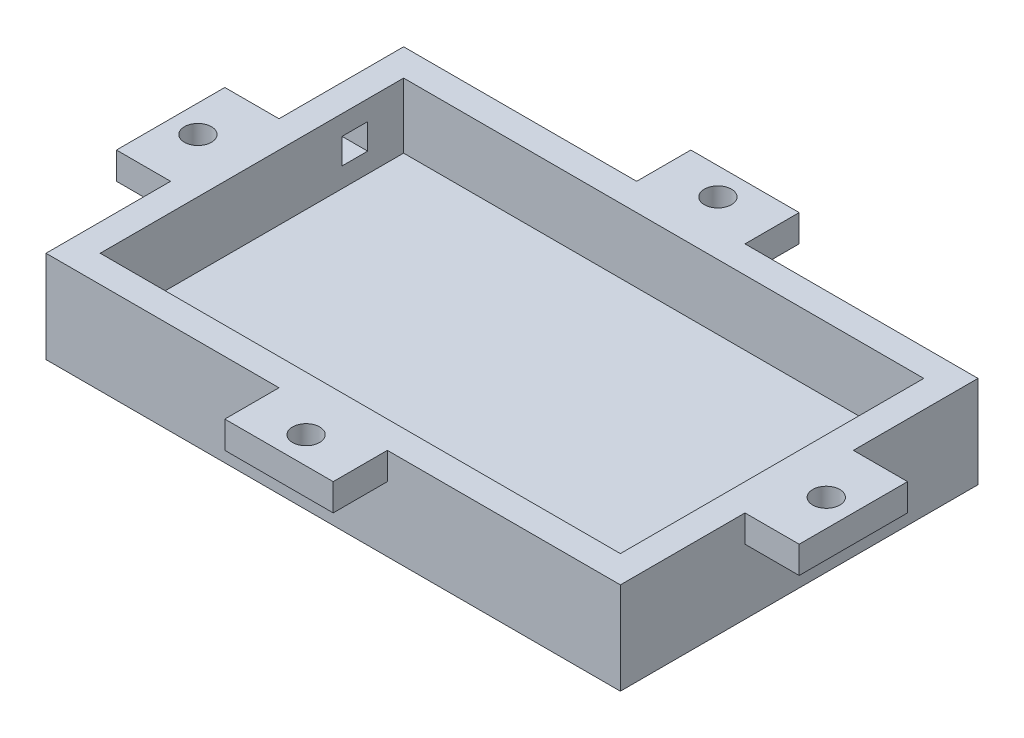
ISO-10303-21;
HEADER;
FILE_DESCRIPTION(('STEP AP214'),'2;1');
FILE_NAME('part.step','',(''),(''),'','','');
FILE_SCHEMA(('AUTOMOTIVE_DESIGN { 1 0 10303 214 1 1 1 1 }'));
ENDSEC;
DATA;
#1=APPLICATION_CONTEXT('core data for automotive mechanical design processes');
#2=APPLICATION_PROTOCOL_DEFINITION('international standard','automotive_design',2000,#1);
#3=PRODUCT_CONTEXT('',#1,'mechanical');
#4=PRODUCT('Part','Part','',(#3));
#5=PRODUCT_RELATED_PRODUCT_CATEGORY('part','',(#4));
#6=PRODUCT_DEFINITION_FORMATION('','',#4);
#7=PRODUCT_DEFINITION_CONTEXT('part definition',#1,'design');
#8=PRODUCT_DEFINITION('design','',#6,#7);
#9=PRODUCT_DEFINITION_SHAPE('','',#8);
#10=(LENGTH_UNIT() NAMED_UNIT(*) SI_UNIT(.MILLI.,.METRE.));
#11=(NAMED_UNIT(*) PLANE_ANGLE_UNIT() SI_UNIT($,.RADIAN.));
#12=(NAMED_UNIT(*) SI_UNIT($,.STERADIAN.) SOLID_ANGLE_UNIT());
#13=UNCERTAINTY_MEASURE_WITH_UNIT(LENGTH_MEASURE(1.E-05),#10,'distance_accuracy_value','');
#14=(GEOMETRIC_REPRESENTATION_CONTEXT(3) GLOBAL_UNCERTAINTY_ASSIGNED_CONTEXT((#13)) GLOBAL_UNIT_ASSIGNED_CONTEXT((#10,
#11,#12)) REPRESENTATION_CONTEXT('',''));
#15=CARTESIAN_POINT('',(0.,0.,0.));
#16=DIRECTION('',(0.,0.,1.));
#17=DIRECTION('',(1.,0.,0.));
#18=AXIS2_PLACEMENT_3D('',#15,#16,#17);
#19=CARTESIAN_POINT('',(-33.655,3.175,20.955));
#20=DIRECTION('',(0.,0.,-1.));
#21=DIRECTION('',(-1.,0.,0.));
#22=AXIS2_PLACEMENT_3D('',#19,#20,#21);
#23=PLANE('',#22);
#24=DIRECTION('',(0.,1.,0.));
#25=VECTOR('',#24,1.);
#26=CARTESIAN_POINT('',(6.34999999999999,7.62,20.955));
#27=LINE('',#26,#25);
#28=CARTESIAN_POINT('',(6.34999999999999,7.62,20.955));
#29=VERTEX_POINT('',#28);
#30=CARTESIAN_POINT('',(6.34999999999999,10.795,20.955));
#31=VERTEX_POINT('',#30);
#32=EDGE_CURVE('E297',#29,#31,#27,.T.);
#33=ORIENTED_EDGE('',*,*,#32,.F.);
#34=DIRECTION('',(1.,0.,0.));
#35=VECTOR('',#34,1.);
#36=CARTESIAN_POINT('',(-6.35000000000001,7.62,20.955));
#37=LINE('',#36,#35);
#38=CARTESIAN_POINT('',(-6.35000000000001,7.62,20.955));
#39=VERTEX_POINT('',#38);
#40=EDGE_CURVE('E317',#39,#29,#37,.T.);
#41=ORIENTED_EDGE('',*,*,#40,.F.);
#42=DIRECTION('',(0.,1.,0.));
#43=VECTOR('',#42,1.);
#44=CARTESIAN_POINT('',(-6.35000000000001,7.62,20.955));
#45=LINE('',#44,#43);
#46=CARTESIAN_POINT('',(-6.35000000000002,10.795,20.955));
#47=VERTEX_POINT('',#46);
#48=EDGE_CURVE('E307',#39,#47,#45,.T.);
#49=ORIENTED_EDGE('',*,*,#48,.T.);
#50=DIRECTION('',(1.,0.,0.));
#51=VECTOR('',#50,1.);
#52=CARTESIAN_POINT('',(-33.655,10.795,20.955));
#53=LINE('',#52,#51);
#54=CARTESIAN_POINT('',(-33.655,10.795,20.955));
#55=VERTEX_POINT('',#54);
#56=EDGE_CURVE('E513',#55,#47,#53,.T.);
#57=ORIENTED_EDGE('',*,*,#56,.F.);
#58=DIRECTION('',(0.,-1.,0.));
#59=VECTOR('',#58,1.);
#60=CARTESIAN_POINT('',(-33.655,3.175,20.955));
#61=LINE('',#60,#59);
#62=CARTESIAN_POINT('',(-33.655,0.,20.955));
#63=VERTEX_POINT('',#62);
#64=EDGE_CURVE('E532',#55,#63,#61,.T.);
#65=ORIENTED_EDGE('',*,*,#64,.T.);
#66=DIRECTION('',(1.,0.,0.));
#67=VECTOR('',#66,1.);
#68=CARTESIAN_POINT('',(-33.655,0.,20.955));
#69=LINE('',#68,#67);
#70=CARTESIAN_POINT('',(33.655,0.,20.955));
#71=VERTEX_POINT('',#70);
#72=EDGE_CURVE('E517',#63,#71,#69,.T.);
#73=ORIENTED_EDGE('',*,*,#72,.T.);
#74=DIRECTION('',(0.,-1.,0.));
#75=VECTOR('',#74,1.);
#76=CARTESIAN_POINT('',(33.655,3.175,20.955));
#77=LINE('',#76,#75);
#78=CARTESIAN_POINT('',(33.655,10.795,20.955));
#79=VERTEX_POINT('',#78);
#80=EDGE_CURVE('E12',#79,#71,#77,.T.);
#81=ORIENTED_EDGE('',*,*,#80,.F.);
#82=EDGE_CURVE('E512',#31,#79,#53,.T.);
#83=ORIENTED_EDGE('',*,*,#82,.F.);
#84=EDGE_LOOP('',(#33,#41,#49,#57,#65,#73,#81,#83));
#85=FACE_BOUND('',#84,.T.);
#86=ADVANCED_FACE('F47',(#85),#23,.F.);
#87=CARTESIAN_POINT('',(-33.655,3.175,-20.955));
#88=DIRECTION('',(1.,0.,0.));
#89=DIRECTION('',(0.,0.,-1.));
#90=AXIS2_PLACEMENT_3D('',#87,#88,#89);
#91=PLANE('',#90);
#92=DIRECTION('',(0.,0.,-1.));
#93=VECTOR('',#92,1.);
#94=CARTESIAN_POINT('',(-33.655,8.485,-20.955));
#95=LINE('',#94,#93);
#96=CARTESIAN_POINT('',(-33.655,8.485,-10.5656207659272));
#97=VERTEX_POINT('',#96);
#98=CARTESIAN_POINT('',(-33.655,8.485,-13.5656207659273));
#99=VERTEX_POINT('',#98);
#100=EDGE_CURVE('E273',#97,#99,#95,.T.);
#101=ORIENTED_EDGE('',*,*,#100,.F.);
#102=DIRECTION('',(0.,-1.,0.));
#103=VECTOR('',#102,1.);
#104=CARTESIAN_POINT('',(-33.655,3.17499999999999,-10.5656207659273));
#105=LINE('',#104,#103);
#106=CARTESIAN_POINT('',(-33.655,5.485,-10.5656207659273));
#107=VERTEX_POINT('',#106);
#108=EDGE_CURVE('E276',#97,#107,#105,.T.);
#109=ORIENTED_EDGE('',*,*,#108,.T.);
#110=DIRECTION('',(0.,0.,-1.));
#111=VECTOR('',#110,1.);
#112=CARTESIAN_POINT('',(-33.655,5.485,-20.955));
#113=LINE('',#112,#111);
#114=CARTESIAN_POINT('',(-33.655,5.485,-13.5656207659273));
#115=VERTEX_POINT('',#114);
#116=EDGE_CURVE('E264',#107,#115,#113,.T.);
#117=ORIENTED_EDGE('',*,*,#116,.T.);
#118=DIRECTION('',(0.,-1.,0.));
#119=VECTOR('',#118,1.);
#120=CARTESIAN_POINT('',(-33.655,3.175,-13.5656207659273));
#121=LINE('',#120,#119);
#122=EDGE_CURVE('E239',#99,#115,#121,.T.);
#123=ORIENTED_EDGE('',*,*,#122,.F.);
#124=EDGE_LOOP('',(#101,#109,#117,#123));
#125=FACE_BOUND('',#124,.T.);
#126=DIRECTION('',(0.,1.,0.));
#127=VECTOR('',#126,1.);
#128=CARTESIAN_POINT('',(-33.655,7.62,6.35));
#129=LINE('',#128,#127);
#130=CARTESIAN_POINT('',(-33.655,7.62,6.35));
#131=VERTEX_POINT('',#130);
#132=CARTESIAN_POINT('',(-33.655,10.795,6.35));
#133=VERTEX_POINT('',#132);
#134=EDGE_CURVE('E451',#131,#133,#129,.T.);
#135=ORIENTED_EDGE('',*,*,#134,.F.);
#136=DIRECTION('',(0.,0.,1.));
#137=VECTOR('',#136,1.);
#138=CARTESIAN_POINT('',(-33.655,7.62,-6.35));
#139=LINE('',#138,#137);
#140=CARTESIAN_POINT('',(-33.655,7.62,-6.35));
#141=VERTEX_POINT('',#140);
#142=EDGE_CURVE('E427',#141,#131,#139,.T.);
#143=ORIENTED_EDGE('',*,*,#142,.F.);
#144=DIRECTION('',(0.,1.,0.));
#145=VECTOR('',#144,1.);
#146=CARTESIAN_POINT('',(-33.655,7.62,-6.35));
#147=LINE('',#146,#145);
#148=CARTESIAN_POINT('',(-33.655,10.795,-6.35));
#149=VERTEX_POINT('',#148);
#150=EDGE_CURVE('E447',#141,#149,#147,.T.);
#151=ORIENTED_EDGE('',*,*,#150,.T.);
#152=DIRECTION('',(0.,0.,1.));
#153=VECTOR('',#152,1.);
#154=CARTESIAN_POINT('',(-33.655,10.795,-20.955));
#155=LINE('',#154,#153);
#156=CARTESIAN_POINT('',(-33.655,10.795,-20.955));
#157=VERTEX_POINT('',#156);
#158=EDGE_CURVE('E508',#157,#149,#155,.T.);
#159=ORIENTED_EDGE('',*,*,#158,.F.);
#160=DIRECTION('',(0.,-1.,0.));
#161=VECTOR('',#160,1.);
#162=CARTESIAN_POINT('',(-33.655,3.175,-20.955));
#163=LINE('',#162,#161);
#164=CARTESIAN_POINT('',(-33.655,0.,-20.955));
#165=VERTEX_POINT('',#164);
#166=EDGE_CURVE('E536',#157,#165,#163,.T.);
#167=ORIENTED_EDGE('',*,*,#166,.T.);
#168=DIRECTION('',(0.,0.,1.));
#169=VECTOR('',#168,1.);
#170=CARTESIAN_POINT('',(-33.655,0.,-20.955));
#171=LINE('',#170,#169);
#172=EDGE_CURVE('E529',#165,#63,#171,.T.);
#173=ORIENTED_EDGE('',*,*,#172,.T.);
#174=ORIENTED_EDGE('',*,*,#64,.F.);
#175=EDGE_CURVE('E507',#133,#55,#155,.T.);
#176=ORIENTED_EDGE('',*,*,#175,.F.);
#177=EDGE_LOOP('',(#135,#143,#151,#159,#167,#173,#174,#176));
#178=FACE_BOUND('',#177,.T.);
#179=ADVANCED_FACE('F575',(#125,#178),#91,.F.);
#180=CARTESIAN_POINT('',(33.655,3.175,-20.955));
#181=DIRECTION('',(1.,0.,0.));
#182=DIRECTION('',(0.,0.,-1.));
#183=AXIS2_PLACEMENT_3D('',#180,#181,#182);
#184=PLANE('',#183);
#185=DIRECTION('',(0.,1.,0.));
#186=VECTOR('',#185,1.);
#187=CARTESIAN_POINT('',(33.655,7.62,-6.34999999999999));
#188=LINE('',#187,#186);
#189=CARTESIAN_POINT('',(33.655,7.62,-6.34999999999999));
#190=VERTEX_POINT('',#189);
#191=CARTESIAN_POINT('',(33.655,10.795,-6.34999999999999));
#192=VERTEX_POINT('',#191);
#193=EDGE_CURVE('E325',#190,#192,#188,.T.);
#194=ORIENTED_EDGE('',*,*,#193,.F.);
#195=DIRECTION('',(0.,0.,1.));
#196=VECTOR('',#195,1.);
#197=CARTESIAN_POINT('',(33.655,7.62,-6.34999999999999));
#198=LINE('',#197,#196);
#199=CARTESIAN_POINT('',(33.655,7.62,6.35));
#200=VERTEX_POINT('',#199);
#201=EDGE_CURVE('E357',#190,#200,#198,.T.);
#202=ORIENTED_EDGE('',*,*,#201,.T.);
#203=DIRECTION('',(0.,1.,0.));
#204=VECTOR('',#203,1.);
#205=CARTESIAN_POINT('',(33.655,7.62,6.35));
#206=LINE('',#205,#204);
#207=CARTESIAN_POINT('',(33.655,10.795,6.35));
#208=VERTEX_POINT('',#207);
#209=EDGE_CURVE('E339',#200,#208,#206,.T.);
#210=ORIENTED_EDGE('',*,*,#209,.T.);
#211=DIRECTION('',(0.,0.,-1.));
#212=VECTOR('',#211,1.);
#213=CARTESIAN_POINT('',(33.655,10.795,-20.955));
#214=LINE('',#213,#212);
#215=EDGE_CURVE('E498',#79,#208,#214,.T.);
#216=ORIENTED_EDGE('',*,*,#215,.F.);
#217=ORIENTED_EDGE('',*,*,#80,.T.);
#218=DIRECTION('',(0.,0.,1.));
#219=VECTOR('',#218,1.);
#220=CARTESIAN_POINT('',(33.655,0.,-20.955));
#221=LINE('',#220,#219);
#222=CARTESIAN_POINT('',(33.655,0.,-20.955));
#223=VERTEX_POINT('',#222);
#224=EDGE_CURVE('E521',#223,#71,#221,.T.);
#225=ORIENTED_EDGE('',*,*,#224,.F.);
#226=DIRECTION('',(0.,-1.,0.));
#227=VECTOR('',#226,1.);
#228=CARTESIAN_POINT('',(33.655,3.175,-20.955));
#229=LINE('',#228,#227);
#230=CARTESIAN_POINT('',(33.655,10.795,-20.955));
#231=VERTEX_POINT('',#230);
#232=EDGE_CURVE('E56',#231,#223,#229,.T.);
#233=ORIENTED_EDGE('',*,*,#232,.F.);
#234=EDGE_CURVE('E497',#192,#231,#214,.T.);
#235=ORIENTED_EDGE('',*,*,#234,.F.);
#236=EDGE_LOOP('',(#194,#202,#210,#216,#217,#225,#233,#235));
#237=FACE_BOUND('',#236,.T.);
#238=ADVANCED_FACE('F580',(#237),#184,.T.);
#239=CARTESIAN_POINT('',(-33.655,3.175,-20.955));
#240=DIRECTION('',(0.,0.,-1.));
#241=DIRECTION('',(-1.,0.,0.));
#242=AXIS2_PLACEMENT_3D('',#239,#240,#241);
#243=PLANE('',#242);
#244=DIRECTION('',(0.,1.,0.));
#245=VECTOR('',#244,1.);
#246=CARTESIAN_POINT('',(-6.35,7.62,-20.955));
#247=LINE('',#246,#245);
#248=CARTESIAN_POINT('',(-6.35,7.62,-20.955));
#249=VERTEX_POINT('',#248);
#250=CARTESIAN_POINT('',(-6.35,10.795,-20.955));
#251=VERTEX_POINT('',#250);
#252=EDGE_CURVE('E385',#249,#251,#247,.T.);
#253=ORIENTED_EDGE('',*,*,#252,.F.);
#254=DIRECTION('',(1.,0.,0.));
#255=VECTOR('',#254,1.);
#256=CARTESIAN_POINT('',(-6.35,7.62,-20.955));
#257=LINE('',#256,#255);
#258=CARTESIAN_POINT('',(6.35,7.62,-20.955));
#259=VERTEX_POINT('',#258);
#260=EDGE_CURVE('E408',#249,#259,#257,.T.);
#261=ORIENTED_EDGE('',*,*,#260,.T.);
#262=DIRECTION('',(0.,1.,0.));
#263=VECTOR('',#262,1.);
#264=CARTESIAN_POINT('',(6.35,7.62,-20.955));
#265=LINE('',#264,#263);
#266=CARTESIAN_POINT('',(6.34999999999999,10.795,-20.955));
#267=VERTEX_POINT('',#266);
#268=EDGE_CURVE('E381',#259,#267,#265,.T.);
#269=ORIENTED_EDGE('',*,*,#268,.T.);
#270=DIRECTION('',(-1.,0.,0.));
#271=VECTOR('',#270,1.);
#272=CARTESIAN_POINT('',(-33.655,10.795,-20.955));
#273=LINE('',#272,#271);
#274=EDGE_CURVE('E503',#231,#267,#273,.T.);
#275=ORIENTED_EDGE('',*,*,#274,.F.);
#276=ORIENTED_EDGE('',*,*,#232,.T.);
#277=DIRECTION('',(1.,0.,0.));
#278=VECTOR('',#277,1.);
#279=CARTESIAN_POINT('',(-33.655,0.,-20.955));
#280=LINE('',#279,#278);
#281=EDGE_CURVE('E525',#165,#223,#280,.T.);
#282=ORIENTED_EDGE('',*,*,#281,.F.);
#283=ORIENTED_EDGE('',*,*,#166,.F.);
#284=EDGE_CURVE('E502',#251,#157,#273,.T.);
#285=ORIENTED_EDGE('',*,*,#284,.F.);
#286=EDGE_LOOP('',(#253,#261,#269,#275,#276,#282,#283,#285));
#287=FACE_BOUND('',#286,.T.);
#288=ADVANCED_FACE('F702',(#287),#243,.T.);
#289=CARTESIAN_POINT('',(0.,0.,0.));
#290=DIRECTION('',(0.,-1.,0.));
#291=DIRECTION('',(0.,0.,-1.));
#292=AXIS2_PLACEMENT_3D('',#289,#290,#291);
#293=PLANE('',#292);
#294=ORIENTED_EDGE('',*,*,#72,.F.);
#295=ORIENTED_EDGE('',*,*,#172,.F.);
#296=ORIENTED_EDGE('',*,*,#281,.T.);
#297=ORIENTED_EDGE('',*,*,#224,.T.);
#298=EDGE_LOOP('',(#294,#295,#296,#297));
#299=FACE_BOUND('',#298,.T.);
#300=ADVANCED_FACE('F610',(#299),#293,.T.);
#301=CARTESIAN_POINT('',(0.,10.795,0.));
#302=DIRECTION('',(0.,1.,0.));
#303=DIRECTION('',(0.,0.,1.));
#304=AXIS2_PLACEMENT_3D('',#301,#302,#303);
#305=PLANE('',#304);
#306=CARTESIAN_POINT('',(0.,10.795,24.13));
#307=DIRECTION('',(0.,1.,0.));
#308=DIRECTION('',(0.,0.,1.));
#309=AXIS2_PLACEMENT_3D('',#306,#307,#308);
#310=CIRCLE('',#309,1.5875);
#311=CARTESIAN_POINT('',(0.,10.795,25.7175));
#312=VERTEX_POINT('',#311);
#313=EDGE_CURVE('E281',#312,#312,#310,.T.);
#314=ORIENTED_EDGE('',*,*,#313,.F.);
#315=EDGE_LOOP('',(#314));
#316=FACE_BOUND('',#315,.T.);
#317=CARTESIAN_POINT('',(36.83,10.795,0.));
#318=DIRECTION('',(0.,1.,0.));
#319=DIRECTION('',(0.,0.,1.));
#320=AXIS2_PLACEMENT_3D('',#317,#318,#319);
#321=CIRCLE('',#320,1.5875);
#322=CARTESIAN_POINT('',(36.83,10.795,1.5875));
#323=VERTEX_POINT('',#322);
#324=EDGE_CURVE('E286',#323,#323,#321,.T.);
#325=ORIENTED_EDGE('',*,*,#324,.F.);
#326=EDGE_LOOP('',(#325));
#327=FACE_BOUND('',#326,.T.);
#328=CARTESIAN_POINT('',(-36.8064146648023,10.795,0.));
#329=DIRECTION('',(0.,1.,0.));
#330=DIRECTION('',(0.,0.,1.));
#331=AXIS2_PLACEMENT_3D('',#328,#329,#330);
#332=CIRCLE('',#331,1.5875);
#333=CARTESIAN_POINT('',(-36.8064146648023,10.795,1.5875));
#334=VERTEX_POINT('',#333);
#335=EDGE_CURVE('E290',#334,#334,#332,.T.);
#336=ORIENTED_EDGE('',*,*,#335,.F.);
#337=EDGE_LOOP('',(#336));
#338=FACE_BOUND('',#337,.T.);
#339=CARTESIAN_POINT('',(0.,10.795,-24.13));
#340=DIRECTION('',(0.,1.,0.));
#341=DIRECTION('',(0.,0.,1.));
#342=AXIS2_PLACEMENT_3D('',#339,#340,#341);
#343=CIRCLE('',#342,1.5875);
#344=CARTESIAN_POINT('',(0.,10.795,-22.5425));
#345=VERTEX_POINT('',#344);
#346=EDGE_CURVE('E280',#345,#345,#343,.T.);
#347=ORIENTED_EDGE('',*,*,#346,.F.);
#348=EDGE_LOOP('',(#347));
#349=FACE_BOUND('',#348,.T.);
#350=ORIENTED_EDGE('',*,*,#215,.T.);
#351=DIRECTION('',(1.,0.,0.));
#352=VECTOR('',#351,1.);
#353=CARTESIAN_POINT('',(33.655,10.795,6.35));
#354=LINE('',#353,#352);
#355=CARTESIAN_POINT('',(40.005,10.795,6.35));
#356=VERTEX_POINT('',#355);
#357=EDGE_CURVE('E361',#208,#356,#354,.T.);
#358=ORIENTED_EDGE('',*,*,#357,.T.);
#359=DIRECTION('',(0.,0.,1.));
#360=VECTOR('',#359,1.);
#361=CARTESIAN_POINT('',(40.005,10.795,-6.34999999999999));
#362=LINE('',#361,#360);
#363=CARTESIAN_POINT('',(40.005,10.795,-6.34999999999999));
#364=VERTEX_POINT('',#363);
#365=EDGE_CURVE('E356',#364,#356,#362,.T.);
#366=ORIENTED_EDGE('',*,*,#365,.F.);
#367=DIRECTION('',(1.,0.,0.));
#368=VECTOR('',#367,1.);
#369=CARTESIAN_POINT('',(33.655,10.795,-6.34999999999999));
#370=LINE('',#369,#368);
#371=EDGE_CURVE('E353',#192,#364,#370,.T.);
#372=ORIENTED_EDGE('',*,*,#371,.F.);
#373=ORIENTED_EDGE('',*,*,#234,.T.);
#374=ORIENTED_EDGE('',*,*,#274,.T.);
#375=DIRECTION('',(0.,0.,1.));
#376=VECTOR('',#375,1.);
#377=CARTESIAN_POINT('',(6.35,10.795,-27.305));
#378=LINE('',#377,#376);
#379=CARTESIAN_POINT('',(6.35,10.795,-27.305));
#380=VERTEX_POINT('',#379);
#381=EDGE_CURVE('E396',#380,#267,#378,.T.);
#382=ORIENTED_EDGE('',*,*,#381,.F.);
#383=DIRECTION('',(1.,0.,0.));
#384=VECTOR('',#383,1.);
#385=CARTESIAN_POINT('',(-6.35,10.795,-27.305));
#386=LINE('',#385,#384);
#387=CARTESIAN_POINT('',(-6.35,10.795,-27.305));
#388=VERTEX_POINT('',#387);
#389=EDGE_CURVE('E400',#388,#380,#386,.T.);
#390=ORIENTED_EDGE('',*,*,#389,.F.);
#391=DIRECTION('',(0.,0.,1.));
#392=VECTOR('',#391,1.);
#393=CARTESIAN_POINT('',(-6.35,10.795,-27.305));
#394=LINE('',#393,#392);
#395=EDGE_CURVE('E392',#388,#251,#394,.T.);
#396=ORIENTED_EDGE('',*,*,#395,.T.);
#397=ORIENTED_EDGE('',*,*,#284,.T.);
#398=ORIENTED_EDGE('',*,*,#158,.T.);
#399=DIRECTION('',(1.,0.,0.));
#400=VECTOR('',#399,1.);
#401=CARTESIAN_POINT('',(-40.005,10.795,-6.35));
#402=LINE('',#401,#400);
#403=CARTESIAN_POINT('',(-40.005,10.795,-6.35));
#404=VERTEX_POINT('',#403);
#405=EDGE_CURVE('E423',#404,#149,#402,.T.);
#406=ORIENTED_EDGE('',*,*,#405,.F.);
#407=DIRECTION('',(0.,0.,1.));
#408=VECTOR('',#407,1.);
#409=CARTESIAN_POINT('',(-40.005,10.795,-6.35));
#410=LINE('',#409,#408);
#411=CARTESIAN_POINT('',(-40.005,10.795,6.35));
#412=VERTEX_POINT('',#411);
#413=EDGE_CURVE('E404',#404,#412,#410,.T.);
#414=ORIENTED_EDGE('',*,*,#413,.T.);
#415=DIRECTION('',(1.,0.,0.));
#416=VECTOR('',#415,1.);
#417=CARTESIAN_POINT('',(-40.005,10.795,6.35));
#418=LINE('',#417,#416);
#419=EDGE_CURVE('E437',#412,#133,#418,.T.);
#420=ORIENTED_EDGE('',*,*,#419,.T.);
#421=ORIENTED_EDGE('',*,*,#175,.T.);
#422=ORIENTED_EDGE('',*,*,#56,.T.);
#423=DIRECTION('',(0.,0.,1.));
#424=VECTOR('',#423,1.);
#425=CARTESIAN_POINT('',(-6.35000000000001,10.795,20.955));
#426=LINE('',#425,#424);
#427=CARTESIAN_POINT('',(-6.35,10.795,27.305));
#428=VERTEX_POINT('',#427);
#429=EDGE_CURVE('E312',#47,#428,#426,.T.);
#430=ORIENTED_EDGE('',*,*,#429,.T.);
#431=DIRECTION('',(1.,0.,0.));
#432=VECTOR('',#431,1.);
#433=CARTESIAN_POINT('',(-6.35,10.795,27.305));
#434=LINE('',#433,#432);
#435=CARTESIAN_POINT('',(6.34999999999999,10.795,27.305));
#436=VERTEX_POINT('',#435);
#437=EDGE_CURVE('E316',#428,#436,#434,.T.);
#438=ORIENTED_EDGE('',*,*,#437,.T.);
#439=DIRECTION('',(0.,0.,1.));
#440=VECTOR('',#439,1.);
#441=CARTESIAN_POINT('',(6.34999999999999,10.795,20.955));
#442=LINE('',#441,#440);
#443=EDGE_CURVE('E321',#31,#436,#442,.T.);
#444=ORIENTED_EDGE('',*,*,#443,.F.);
#445=ORIENTED_EDGE('',*,*,#82,.T.);
#446=EDGE_LOOP('',(#350,#358,#366,#372,#373,#374,#382,#390,#396,#397,#398,#406,#414,#420,#421,
#422,#430,#438,#444,#445));
#447=FACE_BOUND('',#446,.T.);
#448=DIRECTION('',(-1.,0.,0.));
#449=VECTOR('',#448,1.);
#450=CARTESIAN_POINT('',(-30.48,10.795,-17.78));
#451=LINE('',#450,#449);
#452=CARTESIAN_POINT('',(30.48,10.795,-17.78));
#453=VERTEX_POINT('',#452);
#454=CARTESIAN_POINT('',(-30.48,10.795,-17.78));
#455=VERTEX_POINT('',#454);
#456=EDGE_CURVE('E459',#453,#455,#451,.T.);
#457=ORIENTED_EDGE('',*,*,#456,.F.);
#458=DIRECTION('',(0.,0.,-1.));
#459=VECTOR('',#458,1.);
#460=CARTESIAN_POINT('',(30.48,10.795,-17.78));
#461=LINE('',#460,#459);
#462=CARTESIAN_POINT('',(30.48,10.795,17.78));
#463=VERTEX_POINT('',#462);
#464=EDGE_CURVE('E456',#463,#453,#461,.T.);
#465=ORIENTED_EDGE('',*,*,#464,.F.);
#466=DIRECTION('',(1.,0.,0.));
#467=VECTOR('',#466,1.);
#468=CARTESIAN_POINT('',(-30.48,10.795,17.78));
#469=LINE('',#468,#467);
#470=CARTESIAN_POINT('',(-30.48,10.795,17.78));
#471=VERTEX_POINT('',#470);
#472=EDGE_CURVE('E467',#471,#463,#469,.T.);
#473=ORIENTED_EDGE('',*,*,#472,.F.);
#474=DIRECTION('',(0.,0.,1.));
#475=VECTOR('',#474,1.);
#476=CARTESIAN_POINT('',(-30.48,10.795,-17.78));
#477=LINE('',#476,#475);
#478=EDGE_CURVE('E463',#455,#471,#477,.T.);
#479=ORIENTED_EDGE('',*,*,#478,.F.);
#480=EDGE_LOOP('',(#457,#465,#473,#479));
#481=FACE_BOUND('',#480,.T.);
#482=ADVANCED_FACE('F599',(#316,#327,#338,#349,#447,#481),#305,.T.);
#483=CARTESIAN_POINT('',(30.48,10.795,-17.78));
#484=DIRECTION('',(-1.,0.,0.));
#485=DIRECTION('',(0.,0.,1.));
#486=AXIS2_PLACEMENT_3D('',#483,#484,#485);
#487=PLANE('',#486);
#488=DIRECTION('',(0.,0.,-1.));
#489=VECTOR('',#488,1.);
#490=CARTESIAN_POINT('',(30.48,3.175,-17.78));
#491=LINE('',#490,#489);
#492=CARTESIAN_POINT('',(30.48,3.175,17.78));
#493=VERTEX_POINT('',#492);
#494=CARTESIAN_POINT('',(30.48,3.175,-17.78));
#495=VERTEX_POINT('',#494);
#496=EDGE_CURVE('E446',#493,#495,#491,.T.);
#497=ORIENTED_EDGE('',*,*,#496,.F.);
#498=DIRECTION('',(0.,-1.,0.));
#499=VECTOR('',#498,1.);
#500=CARTESIAN_POINT('',(30.48,10.795,17.78));
#501=LINE('',#500,#499);
#502=EDGE_CURVE('E470',#463,#493,#501,.T.);
#503=ORIENTED_EDGE('',*,*,#502,.F.);
#504=ORIENTED_EDGE('',*,*,#464,.T.);
#505=DIRECTION('',(0.,-1.,0.));
#506=VECTOR('',#505,1.);
#507=CARTESIAN_POINT('',(30.48,10.795,-17.78));
#508=LINE('',#507,#506);
#509=EDGE_CURVE('E493',#453,#495,#508,.T.);
#510=ORIENTED_EDGE('',*,*,#509,.T.);
#511=EDGE_LOOP('',(#497,#503,#504,#510));
#512=FACE_BOUND('',#511,.T.);
#513=ADVANCED_FACE('F690',(#512),#487,.T.);
#514=CARTESIAN_POINT('',(-30.48,10.795,-17.78));
#515=DIRECTION('',(0.,0.,1.));
#516=DIRECTION('',(1.,0.,0.));
#517=AXIS2_PLACEMENT_3D('',#514,#515,#516);
#518=PLANE('',#517);
#519=DIRECTION('',(-1.,0.,0.));
#520=VECTOR('',#519,1.);
#521=CARTESIAN_POINT('',(-30.48,3.175,-17.78));
#522=LINE('',#521,#520);
#523=CARTESIAN_POINT('',(-30.48,3.175,-17.78));
#524=VERTEX_POINT('',#523);
#525=EDGE_CURVE('E474',#495,#524,#522,.T.);
#526=ORIENTED_EDGE('',*,*,#525,.F.);
#527=ORIENTED_EDGE('',*,*,#509,.F.);
#528=ORIENTED_EDGE('',*,*,#456,.T.);
#529=DIRECTION('',(0.,-1.,0.));
#530=VECTOR('',#529,1.);
#531=CARTESIAN_POINT('',(-30.48,10.795,-17.78));
#532=LINE('',#531,#530);
#533=EDGE_CURVE('E490',#455,#524,#532,.T.);
#534=ORIENTED_EDGE('',*,*,#533,.T.);
#535=EDGE_LOOP('',(#526,#527,#528,#534));
#536=FACE_BOUND('',#535,.T.);
#537=ADVANCED_FACE('F687',(#536),#518,.T.);
#538=CARTESIAN_POINT('',(-30.48,10.795,-17.78));
#539=DIRECTION('',(1.,0.,0.));
#540=DIRECTION('',(0.,0.,-1.));
#541=AXIS2_PLACEMENT_3D('',#538,#539,#540);
#542=PLANE('',#541);
#543=DIRECTION('',(0.,-1.,0.));
#544=VECTOR('',#543,1.);
#545=CARTESIAN_POINT('',(-30.48,8.485,-10.5656207659272));
#546=LINE('',#545,#544);
#547=CARTESIAN_POINT('',(-30.48,8.485,-10.5656207659272));
#548=VERTEX_POINT('',#547);
#549=CARTESIAN_POINT('',(-30.48,5.485,-10.5656207659272));
#550=VERTEX_POINT('',#549);
#551=EDGE_CURVE('E72',#548,#550,#546,.T.);
#552=ORIENTED_EDGE('',*,*,#551,.F.);
#553=DIRECTION('',(0.,0.,-1.));
#554=VECTOR('',#553,1.);
#555=CARTESIAN_POINT('',(-30.48,8.485,-10.5656207659272));
#556=LINE('',#555,#554);
#557=CARTESIAN_POINT('',(-30.48,8.485,-13.5656207659273));
#558=VERTEX_POINT('',#557);
#559=EDGE_CURVE('E254',#548,#558,#556,.T.);
#560=ORIENTED_EDGE('',*,*,#559,.T.);
#561=DIRECTION('',(0.,-1.,0.));
#562=VECTOR('',#561,1.);
#563=CARTESIAN_POINT('',(-30.48,8.485,-13.5656207659273));
#564=LINE('',#563,#562);
#565=CARTESIAN_POINT('',(-30.48,5.485,-13.5656207659273));
#566=VERTEX_POINT('',#565);
#567=EDGE_CURVE('E236',#558,#566,#564,.T.);
#568=ORIENTED_EDGE('',*,*,#567,.T.);
#569=DIRECTION('',(0.,0.,-1.));
#570=VECTOR('',#569,1.);
#571=CARTESIAN_POINT('',(-30.48,5.485,-10.5656207659273));
#572=LINE('',#571,#570);
#573=EDGE_CURVE('E246',#550,#566,#572,.T.);
#574=ORIENTED_EDGE('',*,*,#573,.F.);
#575=EDGE_LOOP('',(#552,#560,#568,#574));
#576=FACE_BOUND('',#575,.T.);
#577=DIRECTION('',(0.,0.,1.));
#578=VECTOR('',#577,1.);
#579=CARTESIAN_POINT('',(-30.48,3.175,-17.78));
#580=LINE('',#579,#578);
#581=CARTESIAN_POINT('',(-30.48,3.175,17.78));
#582=VERTEX_POINT('',#581);
#583=EDGE_CURVE('E478',#524,#582,#580,.T.);
#584=ORIENTED_EDGE('',*,*,#583,.F.);
#585=ORIENTED_EDGE('',*,*,#533,.F.);
#586=ORIENTED_EDGE('',*,*,#478,.T.);
#587=DIRECTION('',(0.,-1.,0.));
#588=VECTOR('',#587,1.);
#589=CARTESIAN_POINT('',(-30.48,10.795,17.78));
#590=LINE('',#589,#588);
#591=EDGE_CURVE('E487',#471,#582,#590,.T.);
#592=ORIENTED_EDGE('',*,*,#591,.T.);
#593=EDGE_LOOP('',(#584,#585,#586,#592));
#594=FACE_BOUND('',#593,.T.);
#595=ADVANCED_FACE('F251',(#576,#594),#542,.T.);
#596=CARTESIAN_POINT('',(-30.48,10.795,17.78));
#597=DIRECTION('',(0.,0.,-1.));
#598=DIRECTION('',(-1.,0.,0.));
#599=AXIS2_PLACEMENT_3D('',#596,#597,#598);
#600=PLANE('',#599);
#601=DIRECTION('',(1.,0.,0.));
#602=VECTOR('',#601,1.);
#603=CARTESIAN_POINT('',(-30.48,3.175,17.78));
#604=LINE('',#603,#602);
#605=EDGE_CURVE('E460',#582,#493,#604,.T.);
#606=ORIENTED_EDGE('',*,*,#605,.F.);
#607=ORIENTED_EDGE('',*,*,#591,.F.);
#608=ORIENTED_EDGE('',*,*,#472,.T.);
#609=ORIENTED_EDGE('',*,*,#502,.T.);
#610=EDGE_LOOP('',(#606,#607,#608,#609));
#611=FACE_BOUND('',#610,.T.);
#612=ADVANCED_FACE('F681',(#611),#600,.T.);
#613=CARTESIAN_POINT('',(0.,3.175,0.));
#614=DIRECTION('',(0.,-1.,0.));
#615=DIRECTION('',(0.,0.,-1.));
#616=AXIS2_PLACEMENT_3D('',#613,#614,#615);
#617=PLANE('',#616);
#618=ORIENTED_EDGE('',*,*,#605,.T.);
#619=ORIENTED_EDGE('',*,*,#496,.T.);
#620=ORIENTED_EDGE('',*,*,#525,.T.);
#621=ORIENTED_EDGE('',*,*,#583,.T.);
#622=EDGE_LOOP('',(#618,#619,#620,#621));
#623=FACE_BOUND('',#622,.T.);
#624=ADVANCED_FACE('F679',(#623),#617,.F.);
#625=CARTESIAN_POINT('',(-40.005,7.62,-6.35));
#626=DIRECTION('',(-1.,0.,0.));
#627=DIRECTION('',(0.,0.,1.));
#628=AXIS2_PLACEMENT_3D('',#625,#626,#627);
#629=PLANE('',#628);
#630=ORIENTED_EDGE('',*,*,#413,.F.);
#631=DIRECTION('',(0.,1.,0.));
#632=VECTOR('',#631,1.);
#633=CARTESIAN_POINT('',(-40.005,7.62,-6.35));
#634=LINE('',#633,#632);
#635=CARTESIAN_POINT('',(-40.005,7.62,-6.35));
#636=VERTEX_POINT('',#635);
#637=EDGE_CURVE('E443',#636,#404,#634,.T.);
#638=ORIENTED_EDGE('',*,*,#637,.F.);
#639=DIRECTION('',(0.,0.,1.));
#640=VECTOR('',#639,1.);
#641=CARTESIAN_POINT('',(-40.005,7.62,-6.35));
#642=LINE('',#641,#640);
#643=CARTESIAN_POINT('',(-40.005,7.62,6.35));
#644=VERTEX_POINT('',#643);
#645=EDGE_CURVE('E418',#636,#644,#642,.T.);
#646=ORIENTED_EDGE('',*,*,#645,.T.);
#647=DIRECTION('',(0.,1.,0.));
#648=VECTOR('',#647,1.);
#649=CARTESIAN_POINT('',(-40.005,7.62,6.35));
#650=LINE('',#649,#648);
#651=EDGE_CURVE('E433',#644,#412,#650,.T.);
#652=ORIENTED_EDGE('',*,*,#651,.T.);
#653=EDGE_LOOP('',(#630,#638,#646,#652));
#654=FACE_BOUND('',#653,.T.);
#655=ADVANCED_FACE('F672',(#654),#629,.T.);
#656=CARTESIAN_POINT('',(-40.005,7.62,-6.35));
#657=DIRECTION('',(0.,0.,1.));
#658=DIRECTION('',(1.,0.,0.));
#659=AXIS2_PLACEMENT_3D('',#656,#657,#658);
#660=PLANE('',#659);
#661=ORIENTED_EDGE('',*,*,#405,.T.);
#662=ORIENTED_EDGE('',*,*,#150,.F.);
#663=DIRECTION('',(1.,0.,0.));
#664=VECTOR('',#663,1.);
#665=CARTESIAN_POINT('',(-40.005,7.62,-6.35));
#666=LINE('',#665,#664);
#667=EDGE_CURVE('E430',#636,#141,#666,.T.);
#668=ORIENTED_EDGE('',*,*,#667,.F.);
#669=ORIENTED_EDGE('',*,*,#637,.T.);
#670=EDGE_LOOP('',(#661,#662,#668,#669));
#671=FACE_BOUND('',#670,.T.);
#672=ADVANCED_FACE('F669',(#671),#660,.F.);
#673=CARTESIAN_POINT('',(-40.005,7.62,6.35));
#674=DIRECTION('',(0.,0.,1.));
#675=DIRECTION('',(1.,0.,0.));
#676=AXIS2_PLACEMENT_3D('',#673,#674,#675);
#677=PLANE('',#676);
#678=ORIENTED_EDGE('',*,*,#419,.F.);
#679=ORIENTED_EDGE('',*,*,#651,.F.);
#680=DIRECTION('',(1.,0.,0.));
#681=VECTOR('',#680,1.);
#682=CARTESIAN_POINT('',(-40.005,7.62,6.35));
#683=LINE('',#682,#681);
#684=EDGE_CURVE('E422',#644,#131,#683,.T.);
#685=ORIENTED_EDGE('',*,*,#684,.T.);
#686=ORIENTED_EDGE('',*,*,#134,.T.);
#687=EDGE_LOOP('',(#678,#679,#685,#686));
#688=FACE_BOUND('',#687,.T.);
#689=ADVANCED_FACE('F668',(#688),#677,.T.);
#690=CARTESIAN_POINT('',(0.,7.62,0.));
#691=DIRECTION('',(0.,1.,0.));
#692=DIRECTION('',(0.,0.,1.));
#693=AXIS2_PLACEMENT_3D('',#690,#691,#692);
#694=PLANE('',#693);
#695=CARTESIAN_POINT('',(-36.8064146648023,7.62,0.));
#696=DIRECTION('',(0.,1.,0.));
#697=DIRECTION('',(0.,0.,1.));
#698=AXIS2_PLACEMENT_3D('',#695,#696,#697);
#699=CIRCLE('',#698,1.5875);
#700=CARTESIAN_POINT('',(-36.8064146648023,7.62,1.5875));
#701=VERTEX_POINT('',#700);
#702=EDGE_CURVE('E50',#701,#701,#699,.T.);
#703=ORIENTED_EDGE('',*,*,#702,.T.);
#704=EDGE_LOOP('',(#703));
#705=FACE_BOUND('',#704,.T.);
#706=ORIENTED_EDGE('',*,*,#645,.F.);
#707=ORIENTED_EDGE('',*,*,#667,.T.);
#708=ORIENTED_EDGE('',*,*,#142,.T.);
#709=ORIENTED_EDGE('',*,*,#684,.F.);
#710=EDGE_LOOP('',(#706,#707,#708,#709));
#711=FACE_BOUND('',#710,.T.);
#712=ADVANCED_FACE('F556',(#705,#711),#694,.F.);
#713=CARTESIAN_POINT('',(-6.35,7.62,-27.305));
#714=DIRECTION('',(0.,0.,1.));
#715=DIRECTION('',(1.,0.,0.));
#716=AXIS2_PLACEMENT_3D('',#713,#714,#715);
#717=PLANE('',#716);
#718=ORIENTED_EDGE('',*,*,#389,.T.);
#719=DIRECTION('',(0.,1.,0.));
#720=VECTOR('',#719,1.);
#721=CARTESIAN_POINT('',(6.35,7.62,-27.305));
#722=LINE('',#721,#720);
#723=CARTESIAN_POINT('',(6.35,7.62,-27.305));
#724=VERTEX_POINT('',#723);
#725=EDGE_CURVE('E365',#724,#380,#722,.T.);
#726=ORIENTED_EDGE('',*,*,#725,.F.);
#727=DIRECTION('',(1.,0.,0.));
#728=VECTOR('',#727,1.);
#729=CARTESIAN_POINT('',(-6.35,7.62,-27.305));
#730=LINE('',#729,#728);
#731=CARTESIAN_POINT('',(-6.35,7.62,-27.305));
#732=VERTEX_POINT('',#731);
#733=EDGE_CURVE('E397',#732,#724,#730,.T.);
#734=ORIENTED_EDGE('',*,*,#733,.F.);
#735=DIRECTION('',(0.,1.,0.));
#736=VECTOR('',#735,1.);
#737=CARTESIAN_POINT('',(-6.35,7.62,-27.305));
#738=LINE('',#737,#736);
#739=EDGE_CURVE('E388',#732,#388,#738,.T.);
#740=ORIENTED_EDGE('',*,*,#739,.T.);
#741=EDGE_LOOP('',(#718,#726,#734,#740));
#742=FACE_BOUND('',#741,.T.);
#743=ADVANCED_FACE('F651',(#742),#717,.F.);
#744=CARTESIAN_POINT('',(6.35,7.62,-27.305));
#745=DIRECTION('',(-1.,0.,0.));
#746=DIRECTION('',(0.,0.,1.));
#747=AXIS2_PLACEMENT_3D('',#744,#745,#746);
#748=PLANE('',#747);
#749=ORIENTED_EDGE('',*,*,#381,.T.);
#750=ORIENTED_EDGE('',*,*,#268,.F.);
#751=DIRECTION('',(0.,0.,1.));
#752=VECTOR('',#751,1.);
#753=CARTESIAN_POINT('',(6.35,7.62,-27.305));
#754=LINE('',#753,#752);
#755=EDGE_CURVE('E412',#724,#259,#754,.T.);
#756=ORIENTED_EDGE('',*,*,#755,.F.);
#757=ORIENTED_EDGE('',*,*,#725,.T.);
#758=EDGE_LOOP('',(#749,#750,#756,#757));
#759=FACE_BOUND('',#758,.T.);
#760=ADVANCED_FACE('F654',(#759),#748,.F.);
#761=CARTESIAN_POINT('',(-6.35,7.62,-27.305));
#762=DIRECTION('',(-1.,0.,0.));
#763=DIRECTION('',(0.,0.,1.));
#764=AXIS2_PLACEMENT_3D('',#761,#762,#763);
#765=PLANE('',#764);
#766=ORIENTED_EDGE('',*,*,#395,.F.);
#767=ORIENTED_EDGE('',*,*,#739,.F.);
#768=DIRECTION('',(0.,0.,1.));
#769=VECTOR('',#768,1.);
#770=CARTESIAN_POINT('',(-6.35,7.62,-27.305));
#771=LINE('',#770,#769);
#772=EDGE_CURVE('E391',#732,#249,#771,.T.);
#773=ORIENTED_EDGE('',*,*,#772,.T.);
#774=ORIENTED_EDGE('',*,*,#252,.T.);
#775=EDGE_LOOP('',(#766,#767,#773,#774));
#776=FACE_BOUND('',#775,.T.);
#777=ADVANCED_FACE('F658',(#776),#765,.T.);
#778=CARTESIAN_POINT('',(0.,7.62,0.));
#779=DIRECTION('',(0.,-1.,0.));
#780=DIRECTION('',(0.,0.,-1.));
#781=AXIS2_PLACEMENT_3D('',#778,#779,#780);
#782=PLANE('',#781);
#783=CARTESIAN_POINT('',(0.,7.62,-24.13));
#784=DIRECTION('',(0.,-1.,0.));
#785=DIRECTION('',(0.,0.,-1.));
#786=AXIS2_PLACEMENT_3D('',#783,#784,#785);
#787=CIRCLE('',#786,1.5875);
#788=CARTESIAN_POINT('',(0.,7.62,-25.7175));
#789=VERTEX_POINT('',#788);
#790=EDGE_CURVE('E547',#789,#789,#787,.T.);
#791=ORIENTED_EDGE('',*,*,#790,.F.);
#792=EDGE_LOOP('',(#791));
#793=FACE_BOUND('',#792,.T.);
#794=ORIENTED_EDGE('',*,*,#733,.T.);
#795=ORIENTED_EDGE('',*,*,#755,.T.);
#796=ORIENTED_EDGE('',*,*,#260,.F.);
#797=ORIENTED_EDGE('',*,*,#772,.F.);
#798=EDGE_LOOP('',(#794,#795,#796,#797));
#799=FACE_BOUND('',#798,.T.);
#800=ADVANCED_FACE('F644',(#793,#799),#782,.T.);
#801=CARTESIAN_POINT('',(33.655,7.62,-6.34999999999999));
#802=DIRECTION('',(0.,0.,1.));
#803=DIRECTION('',(1.,0.,0.));
#804=AXIS2_PLACEMENT_3D('',#801,#802,#803);
#805=PLANE('',#804);
#806=ORIENTED_EDGE('',*,*,#371,.T.);
#807=DIRECTION('',(0.,1.,0.));
#808=VECTOR('',#807,1.);
#809=CARTESIAN_POINT('',(40.005,7.62,-6.34999999999999));
#810=LINE('',#809,#808);
#811=CARTESIAN_POINT('',(40.005,7.62,-6.34999999999999));
#812=VERTEX_POINT('',#811);
#813=EDGE_CURVE('E347',#812,#364,#810,.T.);
#814=ORIENTED_EDGE('',*,*,#813,.F.);
#815=DIRECTION('',(1.,0.,0.));
#816=VECTOR('',#815,1.);
#817=CARTESIAN_POINT('',(33.655,7.62,-6.34999999999999));
#818=LINE('',#817,#816);
#819=EDGE_CURVE('E343',#190,#812,#818,.T.);
#820=ORIENTED_EDGE('',*,*,#819,.F.);
#821=ORIENTED_EDGE('',*,*,#193,.T.);
#822=EDGE_LOOP('',(#806,#814,#820,#821));
#823=FACE_BOUND('',#822,.T.);
#824=ADVANCED_FACE('F626',(#823),#805,.F.);
#825=CARTESIAN_POINT('',(40.005,7.62,-6.34999999999999));
#826=DIRECTION('',(-1.,0.,0.));
#827=DIRECTION('',(0.,0.,1.));
#828=AXIS2_PLACEMENT_3D('',#825,#826,#827);
#829=PLANE('',#828);
#830=ORIENTED_EDGE('',*,*,#365,.T.);
#831=DIRECTION('',(0.,1.,0.));
#832=VECTOR('',#831,1.);
#833=CARTESIAN_POINT('',(40.005,7.62,6.35));
#834=LINE('',#833,#832);
#835=CARTESIAN_POINT('',(40.005,7.62,6.35));
#836=VERTEX_POINT('',#835);
#837=EDGE_CURVE('E344',#836,#356,#834,.T.);
#838=ORIENTED_EDGE('',*,*,#837,.F.);
#839=DIRECTION('',(0.,0.,1.));
#840=VECTOR('',#839,1.);
#841=CARTESIAN_POINT('',(40.005,7.62,-6.34999999999999));
#842=LINE('',#841,#840);
#843=EDGE_CURVE('E368',#812,#836,#842,.T.);
#844=ORIENTED_EDGE('',*,*,#843,.F.);
#845=ORIENTED_EDGE('',*,*,#813,.T.);
#846=EDGE_LOOP('',(#830,#838,#844,#845));
#847=FACE_BOUND('',#846,.T.);
#848=ADVANCED_FACE('F636',(#847),#829,.F.);
#849=CARTESIAN_POINT('',(33.655,7.62,6.35));
#850=DIRECTION('',(0.,0.,1.));
#851=DIRECTION('',(1.,0.,0.));
#852=AXIS2_PLACEMENT_3D('',#849,#850,#851);
#853=PLANE('',#852);
#854=ORIENTED_EDGE('',*,*,#357,.F.);
#855=ORIENTED_EDGE('',*,*,#209,.F.);
#856=DIRECTION('',(1.,0.,0.));
#857=VECTOR('',#856,1.);
#858=CARTESIAN_POINT('',(33.655,7.62,6.35));
#859=LINE('',#858,#857);
#860=EDGE_CURVE('E371',#200,#836,#859,.T.);
#861=ORIENTED_EDGE('',*,*,#860,.T.);
#862=ORIENTED_EDGE('',*,*,#837,.T.);
#863=EDGE_LOOP('',(#854,#855,#861,#862));
#864=FACE_BOUND('',#863,.T.);
#865=ADVANCED_FACE('F634',(#864),#853,.T.);
#866=CARTESIAN_POINT('',(0.,7.62,0.));
#867=DIRECTION('',(0.,1.,0.));
#868=DIRECTION('',(0.,0.,1.));
#869=AXIS2_PLACEMENT_3D('',#866,#867,#868);
#870=PLANE('',#869);
#871=CARTESIAN_POINT('',(36.83,7.62,0.));
#872=DIRECTION('',(0.,1.,0.));
#873=DIRECTION('',(0.,0.,1.));
#874=AXIS2_PLACEMENT_3D('',#871,#872,#873);
#875=CIRCLE('',#874,1.5875);
#876=CARTESIAN_POINT('',(36.83,7.62,1.5875));
#877=VERTEX_POINT('',#876);
#878=EDGE_CURVE('E544',#877,#877,#875,.T.);
#879=ORIENTED_EDGE('',*,*,#878,.T.);
#880=EDGE_LOOP('',(#879));
#881=FACE_BOUND('',#880,.T.);
#882=ORIENTED_EDGE('',*,*,#201,.F.);
#883=ORIENTED_EDGE('',*,*,#819,.T.);
#884=ORIENTED_EDGE('',*,*,#843,.T.);
#885=ORIENTED_EDGE('',*,*,#860,.F.);
#886=EDGE_LOOP('',(#882,#883,#884,#885));
#887=FACE_BOUND('',#886,.T.);
#888=ADVANCED_FACE('F631',(#881,#887),#870,.F.);
#889=CARTESIAN_POINT('',(6.34999999999999,7.62,20.955));
#890=DIRECTION('',(-1.,0.,0.));
#891=DIRECTION('',(0.,0.,1.));
#892=AXIS2_PLACEMENT_3D('',#889,#890,#891);
#893=PLANE('',#892);
#894=ORIENTED_EDGE('',*,*,#443,.T.);
#895=DIRECTION('',(0.,1.,0.));
#896=VECTOR('',#895,1.);
#897=CARTESIAN_POINT('',(6.34999999999999,7.62,27.305));
#898=LINE('',#897,#896);
#899=CARTESIAN_POINT('',(6.34999999999999,7.62,27.305));
#900=VERTEX_POINT('',#899);
#901=EDGE_CURVE('E301',#900,#436,#898,.T.);
#902=ORIENTED_EDGE('',*,*,#901,.F.);
#903=DIRECTION('',(0.,0.,1.));
#904=VECTOR('',#903,1.);
#905=CARTESIAN_POINT('',(6.34999999999999,7.62,20.955));
#906=LINE('',#905,#904);
#907=EDGE_CURVE('E333',#29,#900,#906,.T.);
#908=ORIENTED_EDGE('',*,*,#907,.F.);
#909=ORIENTED_EDGE('',*,*,#32,.T.);
#910=EDGE_LOOP('',(#894,#902,#908,#909));
#911=FACE_BOUND('',#910,.T.);
#912=ADVANCED_FACE('F588',(#911),#893,.F.);
#913=CARTESIAN_POINT('',(-6.35,7.62,27.305));
#914=DIRECTION('',(0.,0.,1.));
#915=DIRECTION('',(1.,0.,0.));
#916=AXIS2_PLACEMENT_3D('',#913,#914,#915);
#917=PLANE('',#916);
#918=ORIENTED_EDGE('',*,*,#437,.F.);
#919=DIRECTION('',(0.,1.,0.));
#920=VECTOR('',#919,1.);
#921=CARTESIAN_POINT('',(-6.35,7.62,27.305));
#922=LINE('',#921,#920);
#923=CARTESIAN_POINT('',(-6.35,7.62,27.305));
#924=VERTEX_POINT('',#923);
#925=EDGE_CURVE('E304',#924,#428,#922,.T.);
#926=ORIENTED_EDGE('',*,*,#925,.F.);
#927=DIRECTION('',(1.,0.,0.));
#928=VECTOR('',#927,1.);
#929=CARTESIAN_POINT('',(-6.35,7.62,27.305));
#930=LINE('',#929,#928);
#931=EDGE_CURVE('E329',#924,#900,#930,.T.);
#932=ORIENTED_EDGE('',*,*,#931,.T.);
#933=ORIENTED_EDGE('',*,*,#901,.T.);
#934=EDGE_LOOP('',(#918,#926,#932,#933));
#935=FACE_BOUND('',#934,.T.);
#936=ADVANCED_FACE('F802',(#935),#917,.T.);
#937=CARTESIAN_POINT('',(-6.35000000000001,7.62,20.955));
#938=DIRECTION('',(-1.,0.,0.));
#939=DIRECTION('',(0.,0.,1.));
#940=AXIS2_PLACEMENT_3D('',#937,#938,#939);
#941=PLANE('',#940);
#942=ORIENTED_EDGE('',*,*,#429,.F.);
#943=ORIENTED_EDGE('',*,*,#48,.F.);
#944=DIRECTION('',(0.,0.,1.));
#945=VECTOR('',#944,1.);
#946=CARTESIAN_POINT('',(-6.35000000000001,7.62,20.955));
#947=LINE('',#946,#945);
#948=EDGE_CURVE('E311',#39,#924,#947,.T.);
#949=ORIENTED_EDGE('',*,*,#948,.T.);
#950=ORIENTED_EDGE('',*,*,#925,.T.);
#951=EDGE_LOOP('',(#942,#943,#949,#950));
#952=FACE_BOUND('',#951,.T.);
#953=ADVANCED_FACE('F595',(#952),#941,.T.);
#954=CARTESIAN_POINT('',(0.,7.62,0.));
#955=DIRECTION('',(0.,-1.,0.));
#956=DIRECTION('',(0.,0.,-1.));
#957=AXIS2_PLACEMENT_3D('',#954,#955,#956);
#958=PLANE('',#957);
#959=CARTESIAN_POINT('',(0.,7.62,24.13));
#960=DIRECTION('',(0.,-1.,0.));
#961=DIRECTION('',(0.,0.,-1.));
#962=AXIS2_PLACEMENT_3D('',#959,#960,#961);
#963=CIRCLE('',#962,1.5875);
#964=CARTESIAN_POINT('',(0.,7.62,22.5425));
#965=VERTEX_POINT('',#964);
#966=EDGE_CURVE('E285',#965,#965,#963,.T.);
#967=ORIENTED_EDGE('',*,*,#966,.F.);
#968=EDGE_LOOP('',(#967));
#969=FACE_BOUND('',#968,.T.);
#970=ORIENTED_EDGE('',*,*,#40,.T.);
#971=ORIENTED_EDGE('',*,*,#907,.T.);
#972=ORIENTED_EDGE('',*,*,#931,.F.);
#973=ORIENTED_EDGE('',*,*,#948,.F.);
#974=EDGE_LOOP('',(#970,#971,#972,#973));
#975=FACE_BOUND('',#974,.T.);
#976=ADVANCED_FACE('F593',(#969,#975),#958,.T.);
#977=CARTESIAN_POINT('',(0.,0.,24.13));
#978=DIRECTION('',(0.,1.,0.));
#979=DIRECTION('',(0.,0.,1.));
#980=AXIS2_PLACEMENT_3D('',#977,#978,#979);
#981=CYLINDRICAL_SURFACE('',#980,1.5875);
#982=ORIENTED_EDGE('',*,*,#966,.T.);
#983=EDGE_LOOP('',(#982));
#984=FACE_BOUND('',#983,.T.);
#985=ORIENTED_EDGE('',*,*,#313,.T.);
#986=EDGE_LOOP('',(#985));
#987=FACE_BOUND('',#986,.T.);
#988=ADVANCED_FACE('F827',(#984,#987),#981,.F.);
#989=CARTESIAN_POINT('',(36.83,0.,0.));
#990=DIRECTION('',(0.,1.,0.));
#991=DIRECTION('',(0.,0.,1.));
#992=AXIS2_PLACEMENT_3D('',#989,#990,#991);
#993=CYLINDRICAL_SURFACE('',#992,1.5875);
#994=ORIENTED_EDGE('',*,*,#324,.T.);
#995=EDGE_LOOP('',(#994));
#996=FACE_BOUND('',#995,.T.);
#997=ORIENTED_EDGE('',*,*,#878,.F.);
#998=EDGE_LOOP('',(#997));
#999=FACE_BOUND('',#998,.T.);
#1000=ADVANCED_FACE('F571',(#996,#999),#993,.F.);
#1001=CARTESIAN_POINT('',(0.,0.,-24.13));
#1002=DIRECTION('',(0.,1.,0.));
#1003=DIRECTION('',(0.,0.,1.));
#1004=AXIS2_PLACEMENT_3D('',#1001,#1002,#1003);
#1005=CYLINDRICAL_SURFACE('',#1004,1.5875);
#1006=ORIENTED_EDGE('',*,*,#790,.T.);
#1007=EDGE_LOOP('',(#1006));
#1008=FACE_BOUND('',#1007,.T.);
#1009=ORIENTED_EDGE('',*,*,#346,.T.);
#1010=EDGE_LOOP('',(#1009));
#1011=FACE_BOUND('',#1010,.T.);
#1012=ADVANCED_FACE('F562',(#1008,#1011),#1005,.F.);
#1013=CARTESIAN_POINT('',(-36.8064146648023,0.,0.));
#1014=DIRECTION('',(0.,1.,0.));
#1015=DIRECTION('',(0.,0.,1.));
#1016=AXIS2_PLACEMENT_3D('',#1013,#1014,#1015);
#1017=CYLINDRICAL_SURFACE('',#1016,1.5875);
#1018=ORIENTED_EDGE('',*,*,#335,.T.);
#1019=EDGE_LOOP('',(#1018));
#1020=FACE_BOUND('',#1019,.T.);
#1021=ORIENTED_EDGE('',*,*,#702,.F.);
#1022=EDGE_LOOP('',(#1021));
#1023=FACE_BOUND('',#1022,.T.);
#1024=ADVANCED_FACE('F559',(#1020,#1023),#1017,.F.);
#1025=CARTESIAN_POINT('',(-40.005,8.485,-10.5656207659272));
#1026=DIRECTION('',(0.,0.,1.));
#1027=DIRECTION('',(0.,-1.,0.));
#1028=AXIS2_PLACEMENT_3D('',#1025,#1026,#1027);
#1029=PLANE('',#1028);
#1030=DIRECTION('',(1.,0.,0.));
#1031=VECTOR('',#1030,1.);
#1032=CARTESIAN_POINT('',(-40.005,8.485,-10.5656207659272));
#1033=LINE('',#1032,#1031);
#1034=EDGE_CURVE('E261',#97,#548,#1033,.T.);
#1035=ORIENTED_EDGE('',*,*,#1034,.T.);
#1036=ORIENTED_EDGE('',*,*,#551,.T.);
#1037=DIRECTION('',(1.,0.,0.));
#1038=VECTOR('',#1037,1.);
#1039=CARTESIAN_POINT('',(-40.005,5.485,-10.5656207659272));
#1040=LINE('',#1039,#1038);
#1041=EDGE_CURVE('E243',#107,#550,#1040,.T.);
#1042=ORIENTED_EDGE('',*,*,#1041,.F.);
#1043=ORIENTED_EDGE('',*,*,#108,.F.);
#1044=EDGE_LOOP('',(#1035,#1036,#1042,#1043));
#1045=FACE_BOUND('',#1044,.T.);
#1046=ADVANCED_FACE('F561',(#1045),#1029,.F.);
#1047=CARTESIAN_POINT('',(-40.005,8.485,-10.5656207659272));
#1048=DIRECTION('',(0.,-1.,0.));
#1049=DIRECTION('',(0.,0.,-1.));
#1050=AXIS2_PLACEMENT_3D('',#1047,#1048,#1049);
#1051=PLANE('',#1050);
#1052=ORIENTED_EDGE('',*,*,#100,.T.);
#1053=DIRECTION('',(1.,0.,0.));
#1054=VECTOR('',#1053,1.);
#1055=CARTESIAN_POINT('',(-40.005,8.485,-13.5656207659273));
#1056=LINE('',#1055,#1054);
#1057=EDGE_CURVE('E242',#99,#558,#1056,.T.);
#1058=ORIENTED_EDGE('',*,*,#1057,.T.);
#1059=ORIENTED_EDGE('',*,*,#559,.F.);
#1060=ORIENTED_EDGE('',*,*,#1034,.F.);
#1061=EDGE_LOOP('',(#1052,#1058,#1059,#1060));
#1062=FACE_BOUND('',#1061,.T.);
#1063=ADVANCED_FACE('F569',(#1062),#1051,.T.);
#1064=CARTESIAN_POINT('',(-40.005,8.485,-13.5656207659273));
#1065=DIRECTION('',(0.,0.,1.));
#1066=DIRECTION('',(1.,0.,0.));
#1067=AXIS2_PLACEMENT_3D('',#1064,#1065,#1066);
#1068=PLANE('',#1067);
#1069=ORIENTED_EDGE('',*,*,#122,.T.);
#1070=DIRECTION('',(1.,0.,0.));
#1071=VECTOR('',#1070,1.);
#1072=CARTESIAN_POINT('',(-40.005,5.485,-13.5656207659273));
#1073=LINE('',#1072,#1071);
#1074=EDGE_CURVE('E64',#115,#566,#1073,.T.);
#1075=ORIENTED_EDGE('',*,*,#1074,.T.);
#1076=ORIENTED_EDGE('',*,*,#567,.F.);
#1077=ORIENTED_EDGE('',*,*,#1057,.F.);
#1078=EDGE_LOOP('',(#1069,#1075,#1076,#1077));
#1079=FACE_BOUND('',#1078,.T.);
#1080=ADVANCED_FACE('F233',(#1079),#1068,.T.);
#1081=CARTESIAN_POINT('',(-40.005,5.485,-10.5656207659272));
#1082=DIRECTION('',(0.,-1.,0.));
#1083=DIRECTION('',(0.,0.,-1.));
#1084=AXIS2_PLACEMENT_3D('',#1081,#1082,#1083);
#1085=PLANE('',#1084);
#1086=ORIENTED_EDGE('',*,*,#1041,.T.);
#1087=ORIENTED_EDGE('',*,*,#573,.T.);
#1088=ORIENTED_EDGE('',*,*,#1074,.F.);
#1089=ORIENTED_EDGE('',*,*,#116,.F.);
#1090=EDGE_LOOP('',(#1086,#1087,#1088,#1089));
#1091=FACE_BOUND('',#1090,.T.);
#1092=ADVANCED_FACE('F247',(#1091),#1085,.F.);
#1093=CLOSED_SHELL('',(#86,#179,#238,#288,#300,#482,#513,#537,#595,#612,#624,#655,#672,#689,
#712,#743,#760,#777,#800,#824,#848,#865,#888,#912,#936,#953,#976,#988,#1000,#1012,#1024,#1046,
#1063,#1080,#1092));
#1094=MANIFOLD_SOLID_BREP('B2',#1093);
#1095=ADVANCED_BREP_SHAPE_REPRESENTATION('',(#18,#1094),#14);
#1096=SHAPE_DEFINITION_REPRESENTATION(#9,#1095);
ENDSEC;
END-ISO-10303-21;
